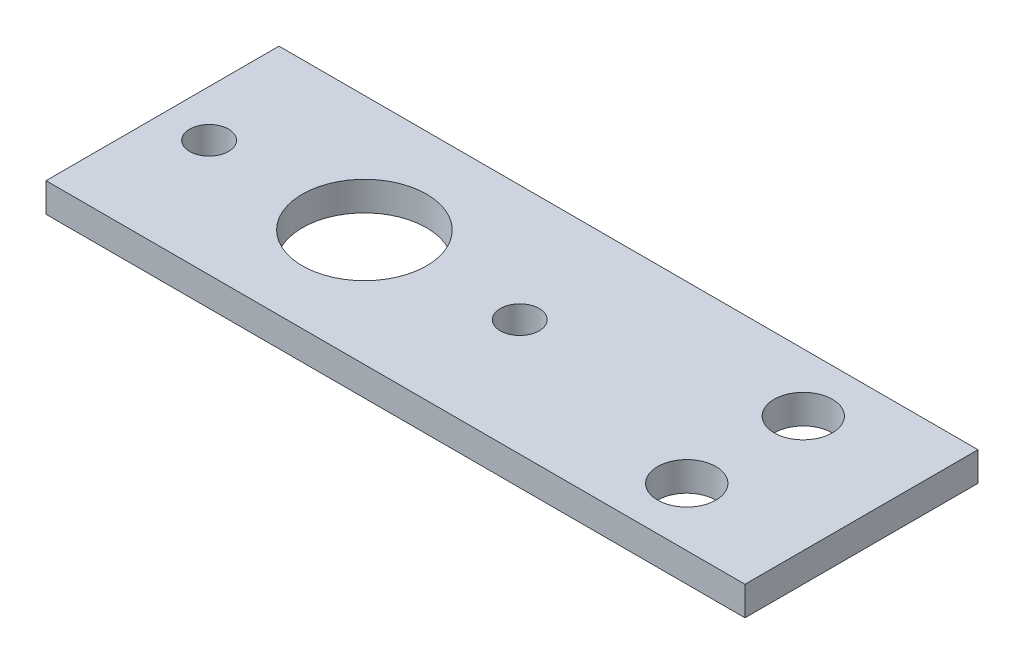
ISO-10303-21;
HEADER;
FILE_DESCRIPTION(('STEP AP214'),'2;1');
FILE_NAME('part.step','',(''),(''),'','','');
FILE_SCHEMA(('AUTOMOTIVE_DESIGN { 1 0 10303 214 1 1 1 1 }'));
ENDSEC;
DATA;
#1=APPLICATION_CONTEXT('core data for automotive mechanical design processes');
#2=APPLICATION_PROTOCOL_DEFINITION('international standard','automotive_design',2000,#1);
#3=PRODUCT_CONTEXT('',#1,'mechanical');
#4=PRODUCT('Part','Part','',(#3));
#5=PRODUCT_RELATED_PRODUCT_CATEGORY('part','',(#4));
#6=PRODUCT_DEFINITION_FORMATION('','',#4);
#7=PRODUCT_DEFINITION_CONTEXT('part definition',#1,'design');
#8=PRODUCT_DEFINITION('design','',#6,#7);
#9=PRODUCT_DEFINITION_SHAPE('','',#8);
#10=(LENGTH_UNIT() NAMED_UNIT(*) SI_UNIT(.MILLI.,.METRE.));
#11=(NAMED_UNIT(*) PLANE_ANGLE_UNIT() SI_UNIT($,.RADIAN.));
#12=(NAMED_UNIT(*) SI_UNIT($,.STERADIAN.) SOLID_ANGLE_UNIT());
#13=UNCERTAINTY_MEASURE_WITH_UNIT(LENGTH_MEASURE(1.E-05),#10,'distance_accuracy_value','');
#14=(GEOMETRIC_REPRESENTATION_CONTEXT(3) GLOBAL_UNCERTAINTY_ASSIGNED_CONTEXT((#13)) GLOBAL_UNIT_ASSIGNED_CONTEXT((#10,
#11,#12)) REPRESENTATION_CONTEXT('',''));
#15=CARTESIAN_POINT('',(0.,0.,0.));
#16=DIRECTION('',(0.,0.,1.));
#17=DIRECTION('',(1.,0.,0.));
#18=AXIS2_PLACEMENT_3D('',#15,#16,#17);
#19=CARTESIAN_POINT('',(0.,4.7625,0.));
#20=DIRECTION('',(0.,-1.,0.));
#21=DIRECTION('',(0.,0.,-1.));
#22=AXIS2_PLACEMENT_3D('',#19,#20,#21);
#23=PLANE('',#22);
#24=DIRECTION('',(0.,0.,1.));
#25=VECTOR('',#24,1.);
#26=CARTESIAN_POINT('',(-114.3,4.7625,19.05));
#27=LINE('',#26,#25);
#28=CARTESIAN_POINT('',(-114.3,4.7625,-19.05));
#29=VERTEX_POINT('',#28);
#30=CARTESIAN_POINT('',(-114.3,4.7625,19.05));
#31=VERTEX_POINT('',#30);
#32=EDGE_CURVE('E95',#29,#31,#27,.T.);
#33=ORIENTED_EDGE('',*,*,#32,.T.);
#34=DIRECTION('',(1.,0.,0.));
#35=VECTOR('',#34,1.);
#36=CARTESIAN_POINT('',(-114.3,4.7625,19.05));
#37=LINE('',#36,#35);
#38=CARTESIAN_POINT('',(0.,4.7625,19.05));
#39=VERTEX_POINT('',#38);
#40=EDGE_CURVE('E90',#31,#39,#37,.T.);
#41=ORIENTED_EDGE('',*,*,#40,.T.);
#42=DIRECTION('',(0.,0.,-1.));
#43=VECTOR('',#42,1.);
#44=CARTESIAN_POINT('',(0.,4.7625,-19.05));
#45=LINE('',#44,#43);
#46=CARTESIAN_POINT('',(0.,4.7625,-19.05));
#47=VERTEX_POINT('',#46);
#48=EDGE_CURVE('E93',#39,#47,#45,.T.);
#49=ORIENTED_EDGE('',*,*,#48,.T.);
#50=DIRECTION('',(-1.,0.,0.));
#51=VECTOR('',#50,1.);
#52=CARTESIAN_POINT('',(-114.3,4.7625,-19.05));
#53=LINE('',#52,#51);
#54=EDGE_CURVE('E60',#47,#29,#53,.T.);
#55=ORIENTED_EDGE('',*,*,#54,.T.);
#56=EDGE_LOOP('',(#33,#41,#49,#55));
#57=FACE_BOUND('',#56,.T.);
#58=CARTESIAN_POINT('',(-106.68,4.7625,0.));
#59=DIRECTION('',(0.,1.,0.));
#60=DIRECTION('',(0.,0.,1.));
#61=AXIS2_PLACEMENT_3D('',#58,#59,#60);
#62=CIRCLE('',#61,3.175);
#63=CARTESIAN_POINT('',(-106.68,4.7625,-3.175));
#64=VERTEX_POINT('',#63);
#65=EDGE_CURVE('E116',#64,#64,#62,.T.);
#66=ORIENTED_EDGE('',*,*,#65,.F.);
#67=EDGE_LOOP('',(#66));
#68=FACE_BOUND('',#67,.T.);
#69=CARTESIAN_POINT('',(-81.28,4.7625,0.));
#70=DIRECTION('',(0.,1.,0.));
#71=DIRECTION('',(0.,0.,1.));
#72=AXIS2_PLACEMENT_3D('',#69,#70,#71);
#73=CIRCLE('',#72,10.16);
#74=CARTESIAN_POINT('',(-81.28,4.7625,-10.16));
#75=VERTEX_POINT('',#74);
#76=EDGE_CURVE('E140',#75,#75,#73,.T.);
#77=ORIENTED_EDGE('',*,*,#76,.F.);
#78=EDGE_LOOP('',(#77));
#79=FACE_BOUND('',#78,.T.);
#80=CARTESIAN_POINT('',(-55.88,4.7625,0.));
#81=DIRECTION('',(0.,1.,0.));
#82=DIRECTION('',(0.,0.,1.));
#83=AXIS2_PLACEMENT_3D('',#80,#81,#82);
#84=CIRCLE('',#83,3.175);
#85=CARTESIAN_POINT('',(-55.88,4.7625,-3.175));
#86=VERTEX_POINT('',#85);
#87=EDGE_CURVE('E148',#86,#86,#84,.T.);
#88=ORIENTED_EDGE('',*,*,#87,.F.);
#89=EDGE_LOOP('',(#88));
#90=FACE_BOUND('',#89,.T.);
#91=CARTESIAN_POINT('',(-19.05,4.7625,-9.52499999999999));
#92=DIRECTION('',(0.,1.,0.));
#93=DIRECTION('',(0.,0.,1.));
#94=AXIS2_PLACEMENT_3D('',#91,#92,#93);
#95=CIRCLE('',#94,4.76250000000001);
#96=CARTESIAN_POINT('',(-19.05,4.7625,-14.2875));
#97=VERTEX_POINT('',#96);
#98=EDGE_CURVE('E156',#97,#97,#95,.T.);
#99=ORIENTED_EDGE('',*,*,#98,.F.);
#100=EDGE_LOOP('',(#99));
#101=FACE_BOUND('',#100,.T.);
#102=CARTESIAN_POINT('',(-19.05,4.7625,9.52500000000001));
#103=DIRECTION('',(0.,1.,0.));
#104=DIRECTION('',(0.,0.,-1.));
#105=AXIS2_PLACEMENT_3D('',#102,#103,#104);
#106=CIRCLE('',#105,4.76250000000001);
#107=CARTESIAN_POINT('',(-19.05,4.7625,4.7625));
#108=VERTEX_POINT('',#107);
#109=EDGE_CURVE('E164',#108,#108,#106,.T.);
#110=ORIENTED_EDGE('',*,*,#109,.F.);
#111=EDGE_LOOP('',(#110));
#112=FACE_BOUND('',#111,.T.);
#113=ADVANCED_FACE('F42',(#57,#68,#79,#90,#101,#112),#23,.F.);
#114=CARTESIAN_POINT('',(0.,0.,0.));
#115=DIRECTION('',(0.,-1.,0.));
#116=DIRECTION('',(0.,0.,-1.));
#117=AXIS2_PLACEMENT_3D('',#114,#115,#116);
#118=PLANE('',#117);
#119=CARTESIAN_POINT('',(-19.05,0.,-9.52499999999999));
#120=DIRECTION('',(0.,1.,0.));
#121=DIRECTION('',(0.,0.,1.));
#122=AXIS2_PLACEMENT_3D('',#119,#120,#121);
#123=CIRCLE('',#122,4.76250000000001);
#124=CARTESIAN_POINT('',(-19.05,0.,-14.2875));
#125=VERTEX_POINT('',#124);
#126=EDGE_CURVE('E160',#125,#125,#123,.T.);
#127=ORIENTED_EDGE('',*,*,#126,.T.);
#128=EDGE_LOOP('',(#127));
#129=FACE_BOUND('',#128,.T.);
#130=CARTESIAN_POINT('',(-81.28,0.,0.));
#131=DIRECTION('',(0.,1.,0.));
#132=DIRECTION('',(0.,0.,1.));
#133=AXIS2_PLACEMENT_3D('',#130,#131,#132);
#134=CIRCLE('',#133,10.16);
#135=CARTESIAN_POINT('',(-81.28,0.,-10.16));
#136=VERTEX_POINT('',#135);
#137=EDGE_CURVE('E144',#136,#136,#134,.T.);
#138=ORIENTED_EDGE('',*,*,#137,.T.);
#139=EDGE_LOOP('',(#138));
#140=FACE_BOUND('',#139,.T.);
#141=DIRECTION('',(0.,0.,1.));
#142=VECTOR('',#141,1.);
#143=CARTESIAN_POINT('',(-114.3,0.,19.05));
#144=LINE('',#143,#142);
#145=CARTESIAN_POINT('',(-114.3,0.,-19.05));
#146=VERTEX_POINT('',#145);
#147=CARTESIAN_POINT('',(-114.3,0.,19.05));
#148=VERTEX_POINT('',#147);
#149=EDGE_CURVE('E112',#146,#148,#144,.T.);
#150=ORIENTED_EDGE('',*,*,#149,.F.);
#151=DIRECTION('',(-1.,0.,0.));
#152=VECTOR('',#151,1.);
#153=CARTESIAN_POINT('',(-114.3,0.,-19.05));
#154=LINE('',#153,#152);
#155=CARTESIAN_POINT('',(0.,0.,-19.05));
#156=VERTEX_POINT('',#155);
#157=EDGE_CURVE('E83',#156,#146,#154,.T.);
#158=ORIENTED_EDGE('',*,*,#157,.F.);
#159=DIRECTION('',(0.,0.,-1.));
#160=VECTOR('',#159,1.);
#161=CARTESIAN_POINT('',(0.,0.,-19.05));
#162=LINE('',#161,#160);
#163=CARTESIAN_POINT('',(0.,0.,19.05));
#164=VERTEX_POINT('',#163);
#165=EDGE_CURVE('E77',#164,#156,#162,.T.);
#166=ORIENTED_EDGE('',*,*,#165,.F.);
#167=DIRECTION('',(1.,0.,0.));
#168=VECTOR('',#167,1.);
#169=CARTESIAN_POINT('',(-114.3,0.,19.05));
#170=LINE('',#169,#168);
#171=EDGE_CURVE('E100',#148,#164,#170,.T.);
#172=ORIENTED_EDGE('',*,*,#171,.F.);
#173=EDGE_LOOP('',(#150,#158,#166,#172));
#174=FACE_BOUND('',#173,.T.);
#175=CARTESIAN_POINT('',(-106.68,0.,0.));
#176=DIRECTION('',(0.,1.,0.));
#177=DIRECTION('',(0.,0.,1.));
#178=AXIS2_PLACEMENT_3D('',#175,#176,#177);
#179=CIRCLE('',#178,3.175);
#180=CARTESIAN_POINT('',(-106.68,0.,-3.175));
#181=VERTEX_POINT('',#180);
#182=EDGE_CURVE('E136',#181,#181,#179,.T.);
#183=ORIENTED_EDGE('',*,*,#182,.T.);
#184=EDGE_LOOP('',(#183));
#185=FACE_BOUND('',#184,.T.);
#186=CARTESIAN_POINT('',(-55.88,0.,0.));
#187=DIRECTION('',(0.,1.,0.));
#188=DIRECTION('',(0.,0.,1.));
#189=AXIS2_PLACEMENT_3D('',#186,#187,#188);
#190=CIRCLE('',#189,3.175);
#191=CARTESIAN_POINT('',(-55.88,0.,-3.175));
#192=VERTEX_POINT('',#191);
#193=EDGE_CURVE('E152',#192,#192,#190,.T.);
#194=ORIENTED_EDGE('',*,*,#193,.T.);
#195=EDGE_LOOP('',(#194));
#196=FACE_BOUND('',#195,.T.);
#197=CARTESIAN_POINT('',(-19.05,0.,9.52500000000001));
#198=DIRECTION('',(0.,1.,0.));
#199=DIRECTION('',(0.,0.,-1.));
#200=AXIS2_PLACEMENT_3D('',#197,#198,#199);
#201=CIRCLE('',#200,4.76250000000001);
#202=CARTESIAN_POINT('',(-19.05,0.,4.7625));
#203=VERTEX_POINT('',#202);
#204=EDGE_CURVE('E168',#203,#203,#201,.T.);
#205=ORIENTED_EDGE('',*,*,#204,.T.);
#206=EDGE_LOOP('',(#205));
#207=FACE_BOUND('',#206,.T.);
#208=ADVANCED_FACE('F130',(#129,#140,#174,#185,#196,#207),#118,.T.);
#209=CARTESIAN_POINT('',(-114.3,4.7625,19.05));
#210=DIRECTION('',(1.,0.,0.));
#211=DIRECTION('',(0.,0.,-1.));
#212=AXIS2_PLACEMENT_3D('',#209,#210,#211);
#213=PLANE('',#212);
#214=ORIENTED_EDGE('',*,*,#149,.T.);
#215=DIRECTION('',(0.,-1.,0.));
#216=VECTOR('',#215,1.);
#217=CARTESIAN_POINT('',(-114.3,4.7625,19.05));
#218=LINE('',#217,#216);
#219=EDGE_CURVE('E11',#31,#148,#218,.T.);
#220=ORIENTED_EDGE('',*,*,#219,.F.);
#221=ORIENTED_EDGE('',*,*,#32,.F.);
#222=DIRECTION('',(0.,-1.,0.));
#223=VECTOR('',#222,1.);
#224=CARTESIAN_POINT('',(-114.3,4.7625,-19.05));
#225=LINE('',#224,#223);
#226=EDGE_CURVE('E108',#29,#146,#225,.T.);
#227=ORIENTED_EDGE('',*,*,#226,.T.);
#228=EDGE_LOOP('',(#214,#220,#221,#227));
#229=FACE_BOUND('',#228,.T.);
#230=ADVANCED_FACE('F44',(#229),#213,.F.);
#231=CARTESIAN_POINT('',(-114.3,4.7625,19.05));
#232=DIRECTION('',(0.,0.,-1.));
#233=DIRECTION('',(-1.,0.,0.));
#234=AXIS2_PLACEMENT_3D('',#231,#232,#233);
#235=PLANE('',#234);
#236=ORIENTED_EDGE('',*,*,#171,.T.);
#237=DIRECTION('',(0.,-1.,0.));
#238=VECTOR('',#237,1.);
#239=CARTESIAN_POINT('',(0.,4.7625,19.05));
#240=LINE('',#239,#238);
#241=EDGE_CURVE('E52',#39,#164,#240,.T.);
#242=ORIENTED_EDGE('',*,*,#241,.F.);
#243=ORIENTED_EDGE('',*,*,#40,.F.);
#244=ORIENTED_EDGE('',*,*,#219,.T.);
#245=EDGE_LOOP('',(#236,#242,#243,#244));
#246=FACE_BOUND('',#245,.T.);
#247=ADVANCED_FACE('F99',(#246),#235,.F.);
#248=CARTESIAN_POINT('',(0.,4.7625,-19.05));
#249=DIRECTION('',(-1.,0.,0.));
#250=DIRECTION('',(0.,0.,1.));
#251=AXIS2_PLACEMENT_3D('',#248,#249,#250);
#252=PLANE('',#251);
#253=ORIENTED_EDGE('',*,*,#165,.T.);
#254=DIRECTION('',(0.,-1.,0.));
#255=VECTOR('',#254,1.);
#256=CARTESIAN_POINT('',(0.,4.7625,-19.05));
#257=LINE('',#256,#255);
#258=EDGE_CURVE('E102',#47,#156,#257,.T.);
#259=ORIENTED_EDGE('',*,*,#258,.F.);
#260=ORIENTED_EDGE('',*,*,#48,.F.);
#261=ORIENTED_EDGE('',*,*,#241,.T.);
#262=EDGE_LOOP('',(#253,#259,#260,#261));
#263=FACE_BOUND('',#262,.T.);
#264=ADVANCED_FACE('F103',(#263),#252,.F.);
#265=CARTESIAN_POINT('',(-114.3,4.7625,-19.05));
#266=DIRECTION('',(0.,0.,1.));
#267=DIRECTION('',(1.,0.,0.));
#268=AXIS2_PLACEMENT_3D('',#265,#266,#267);
#269=PLANE('',#268);
#270=ORIENTED_EDGE('',*,*,#157,.T.);
#271=ORIENTED_EDGE('',*,*,#226,.F.);
#272=ORIENTED_EDGE('',*,*,#54,.F.);
#273=ORIENTED_EDGE('',*,*,#258,.T.);
#274=EDGE_LOOP('',(#270,#271,#272,#273));
#275=FACE_BOUND('',#274,.T.);
#276=ADVANCED_FACE('F127',(#275),#269,.F.);
#277=CARTESIAN_POINT('',(-106.68,4.7625,0.));
#278=DIRECTION('',(0.,-1.,0.));
#279=DIRECTION('',(0.,0.,-1.));
#280=AXIS2_PLACEMENT_3D('',#277,#278,#279);
#281=CYLINDRICAL_SURFACE('',#280,3.175);
#282=CARTESIAN_POINT('',(-106.68,4.7625,-3.175));
#283=CARTESIAN_POINT('',(-106.68,4.712890625,-3.175));
#284=CARTESIAN_POINT('',(-106.68,4.66328125,-3.175));
#285=CARTESIAN_POINT('',(-106.68,4.5640625,-3.175));
#286=CARTESIAN_POINT('',(-106.68,4.514453125,-3.175));
#287=CARTESIAN_POINT('',(-106.68,4.415234375,-3.175));
#288=CARTESIAN_POINT('',(-106.68,4.365625,-3.175));
#289=CARTESIAN_POINT('',(-106.68,4.26640625,-3.175));
#290=CARTESIAN_POINT('',(-106.68,4.216796875,-3.175));
#291=CARTESIAN_POINT('',(-106.68,4.117578125,-3.175));
#292=CARTESIAN_POINT('',(-106.68,4.06796875,-3.175));
#293=CARTESIAN_POINT('',(-106.68,3.96875,-3.175));
#294=CARTESIAN_POINT('',(-106.68,3.919140625,-3.175));
#295=CARTESIAN_POINT('',(-106.68,3.819921875,-3.175));
#296=CARTESIAN_POINT('',(-106.68,3.7703125,-3.175));
#297=CARTESIAN_POINT('',(-106.68,3.67109375,-3.175));
#298=CARTESIAN_POINT('',(-106.68,3.621484375,-3.175));
#299=CARTESIAN_POINT('',(-106.68,3.522265625,-3.175));
#300=CARTESIAN_POINT('',(-106.68,3.47265625,-3.175));
#301=CARTESIAN_POINT('',(-106.68,3.3734375,-3.175));
#302=CARTESIAN_POINT('',(-106.68,3.323828125,-3.175));
#303=CARTESIAN_POINT('',(-106.68,3.224609375,-3.175));
#304=CARTESIAN_POINT('',(-106.68,3.175,-3.175));
#305=CARTESIAN_POINT('',(-106.68,3.07578125,-3.175));
#306=CARTESIAN_POINT('',(-106.68,3.026171875,-3.175));
#307=CARTESIAN_POINT('',(-106.68,2.926953125,-3.175));
#308=CARTESIAN_POINT('',(-106.68,2.87734375,-3.175));
#309=CARTESIAN_POINT('',(-106.68,2.778125,-3.175));
#310=CARTESIAN_POINT('',(-106.68,2.728515625,-3.175));
#311=CARTESIAN_POINT('',(-106.68,2.629296875,-3.175));
#312=CARTESIAN_POINT('',(-106.68,2.5796875,-3.175));
#313=CARTESIAN_POINT('',(-106.68,2.48046875,-3.175));
#314=CARTESIAN_POINT('',(-106.68,2.430859375,-3.175));
#315=CARTESIAN_POINT('',(-106.68,2.331640625,-3.175));
#316=CARTESIAN_POINT('',(-106.68,2.28203125,-3.175));
#317=CARTESIAN_POINT('',(-106.68,2.1828125,-3.175));
#318=CARTESIAN_POINT('',(-106.68,2.133203125,-3.175));
#319=CARTESIAN_POINT('',(-106.68,2.033984375,-3.175));
#320=CARTESIAN_POINT('',(-106.68,1.984375,-3.175));
#321=CARTESIAN_POINT('',(-106.68,1.88515625,-3.175));
#322=CARTESIAN_POINT('',(-106.68,1.835546875,-3.175));
#323=CARTESIAN_POINT('',(-106.68,1.736328125,-3.175));
#324=CARTESIAN_POINT('',(-106.68,1.68671875,-3.175));
#325=CARTESIAN_POINT('',(-106.68,1.5875,-3.175));
#326=CARTESIAN_POINT('',(-106.68,1.537890625,-3.175));
#327=CARTESIAN_POINT('',(-106.68,1.438671875,-3.175));
#328=CARTESIAN_POINT('',(-106.68,1.3890625,-3.175));
#329=CARTESIAN_POINT('',(-106.68,1.28984375,-3.175));
#330=CARTESIAN_POINT('',(-106.68,1.240234375,-3.175));
#331=CARTESIAN_POINT('',(-106.68,1.141015625,-3.175));
#332=CARTESIAN_POINT('',(-106.68,1.09140625,-3.175));
#333=CARTESIAN_POINT('',(-106.68,0.9921875,-3.175));
#334=CARTESIAN_POINT('',(-106.68,0.942578125,-3.175));
#335=CARTESIAN_POINT('',(-106.68,0.843359375,-3.175));
#336=CARTESIAN_POINT('',(-106.68,0.79375,-3.175));
#337=CARTESIAN_POINT('',(-106.68,0.69453125,-3.175));
#338=CARTESIAN_POINT('',(-106.68,0.644921875,-3.175));
#339=CARTESIAN_POINT('',(-106.68,0.545703125,-3.175));
#340=CARTESIAN_POINT('',(-106.68,0.49609375,-3.175));
#341=CARTESIAN_POINT('',(-106.68,0.396875,-3.175));
#342=CARTESIAN_POINT('',(-106.68,0.347265625,-3.175));
#343=CARTESIAN_POINT('',(-106.68,0.248046875,-3.175));
#344=CARTESIAN_POINT('',(-106.68,0.1984375,-3.175));
#345=CARTESIAN_POINT('',(-106.68,0.09921875,-3.175));
#346=CARTESIAN_POINT('',(-106.68,0.049609375,-3.175));
#347=CARTESIAN_POINT('',(-106.68,0.,-3.175));
#348=B_SPLINE_CURVE_WITH_KNOTS('',3,(#282,#283,#284,#285,#286,#287,#288,#289,#290,#291,#292,
#293,#294,#295,#296,#297,#298,#299,#300,#301,#302,#303,#304,#305,#306,#307,#308,#309,#310,#311,
#312,#313,#314,#315,#316,#317,#318,#319,#320,#321,#322,#323,#324,#325,#326,#327,#328,#329,#330,
#331,#332,#333,#334,#335,#336,#337,#338,#339,#340,#341,#342,#343,#344,#345,#346,#347),
.UNSPECIFIED.,.F.,.F.,(4,2,2,2,2,2,2,2,2,2,2,2,2,2,2,2,2,2,2,2,2,2,2,2,2,2,2,2,2,2,2,2,4),(0.,
0.148828124999999,0.297656249999999,0.446484374999999,0.595312499999999,0.744140625,0.89296875,
1.041796875,1.190625,1.339453125,1.48828125,1.637109375,1.7859375,1.934765625,2.08359375,
2.232421875,2.38125,2.530078125,2.67890625,2.827734375,2.9765625,3.125390625,3.27421875,
3.423046875,3.571875,3.720703125,3.86953125,4.018359375,4.1671875,4.316015625,4.46484375,
4.613671875,4.7625),.UNSPECIFIED.);
#349=EDGE_CURVE('BSEAM188',#64,#181,#348,.T.);
#350=ORIENTED_EDGE('',*,*,#65,.T.);
#351=ORIENTED_EDGE('',*,*,#182,.F.);
#352=ORIENTED_EDGE('',*,*,#349,.T.);
#353=ORIENTED_EDGE('',*,*,#349,.F.);
#354=EDGE_LOOP('',(#350,#352,#351,#353));
#355=FACE_BOUND('',#354,.T.);
#356=ADVANCED_FACE('F188',(#355),#281,.F.);
#357=CARTESIAN_POINT('',(-81.28,4.7625,0.));
#358=DIRECTION('',(0.,-1.,0.));
#359=DIRECTION('',(0.,0.,-1.));
#360=AXIS2_PLACEMENT_3D('',#357,#358,#359);
#361=CYLINDRICAL_SURFACE('',#360,10.16);
#362=CARTESIAN_POINT('',(-81.28,4.7625,-10.16));
#363=CARTESIAN_POINT('',(-81.28,4.712890625,-10.16));
#364=CARTESIAN_POINT('',(-81.28,4.66328125,-10.16));
#365=CARTESIAN_POINT('',(-81.28,4.5640625,-10.16));
#366=CARTESIAN_POINT('',(-81.28,4.514453125,-10.16));
#367=CARTESIAN_POINT('',(-81.28,4.415234375,-10.16));
#368=CARTESIAN_POINT('',(-81.28,4.365625,-10.16));
#369=CARTESIAN_POINT('',(-81.28,4.26640625,-10.16));
#370=CARTESIAN_POINT('',(-81.28,4.216796875,-10.16));
#371=CARTESIAN_POINT('',(-81.28,4.117578125,-10.16));
#372=CARTESIAN_POINT('',(-81.28,4.06796875,-10.16));
#373=CARTESIAN_POINT('',(-81.28,3.96875,-10.16));
#374=CARTESIAN_POINT('',(-81.28,3.919140625,-10.16));
#375=CARTESIAN_POINT('',(-81.28,3.819921875,-10.16));
#376=CARTESIAN_POINT('',(-81.28,3.7703125,-10.16));
#377=CARTESIAN_POINT('',(-81.28,3.67109375,-10.16));
#378=CARTESIAN_POINT('',(-81.28,3.621484375,-10.16));
#379=CARTESIAN_POINT('',(-81.28,3.522265625,-10.16));
#380=CARTESIAN_POINT('',(-81.28,3.47265625,-10.16));
#381=CARTESIAN_POINT('',(-81.28,3.3734375,-10.16));
#382=CARTESIAN_POINT('',(-81.28,3.323828125,-10.16));
#383=CARTESIAN_POINT('',(-81.28,3.224609375,-10.16));
#384=CARTESIAN_POINT('',(-81.28,3.175,-10.16));
#385=CARTESIAN_POINT('',(-81.28,3.07578125,-10.16));
#386=CARTESIAN_POINT('',(-81.28,3.026171875,-10.16));
#387=CARTESIAN_POINT('',(-81.28,2.926953125,-10.16));
#388=CARTESIAN_POINT('',(-81.28,2.87734375,-10.16));
#389=CARTESIAN_POINT('',(-81.28,2.778125,-10.16));
#390=CARTESIAN_POINT('',(-81.28,2.728515625,-10.16));
#391=CARTESIAN_POINT('',(-81.28,2.629296875,-10.16));
#392=CARTESIAN_POINT('',(-81.28,2.5796875,-10.16));
#393=CARTESIAN_POINT('',(-81.28,2.48046875,-10.16));
#394=CARTESIAN_POINT('',(-81.28,2.430859375,-10.16));
#395=CARTESIAN_POINT('',(-81.28,2.331640625,-10.16));
#396=CARTESIAN_POINT('',(-81.28,2.28203125,-10.16));
#397=CARTESIAN_POINT('',(-81.28,2.1828125,-10.16));
#398=CARTESIAN_POINT('',(-81.28,2.133203125,-10.16));
#399=CARTESIAN_POINT('',(-81.28,2.033984375,-10.16));
#400=CARTESIAN_POINT('',(-81.28,1.984375,-10.16));
#401=CARTESIAN_POINT('',(-81.28,1.88515625,-10.16));
#402=CARTESIAN_POINT('',(-81.28,1.835546875,-10.16));
#403=CARTESIAN_POINT('',(-81.28,1.736328125,-10.16));
#404=CARTESIAN_POINT('',(-81.28,1.68671875,-10.16));
#405=CARTESIAN_POINT('',(-81.28,1.5875,-10.16));
#406=CARTESIAN_POINT('',(-81.28,1.537890625,-10.16));
#407=CARTESIAN_POINT('',(-81.28,1.438671875,-10.16));
#408=CARTESIAN_POINT('',(-81.28,1.3890625,-10.16));
#409=CARTESIAN_POINT('',(-81.28,1.28984375,-10.16));
#410=CARTESIAN_POINT('',(-81.28,1.240234375,-10.16));
#411=CARTESIAN_POINT('',(-81.28,1.141015625,-10.16));
#412=CARTESIAN_POINT('',(-81.28,1.09140625,-10.16));
#413=CARTESIAN_POINT('',(-81.28,0.9921875,-10.16));
#414=CARTESIAN_POINT('',(-81.28,0.942578125,-10.16));
#415=CARTESIAN_POINT('',(-81.28,0.843359375,-10.16));
#416=CARTESIAN_POINT('',(-81.28,0.79375,-10.16));
#417=CARTESIAN_POINT('',(-81.28,0.69453125,-10.16));
#418=CARTESIAN_POINT('',(-81.28,0.644921875,-10.16));
#419=CARTESIAN_POINT('',(-81.28,0.545703125,-10.16));
#420=CARTESIAN_POINT('',(-81.28,0.49609375,-10.16));
#421=CARTESIAN_POINT('',(-81.28,0.396875,-10.16));
#422=CARTESIAN_POINT('',(-81.28,0.347265625,-10.16));
#423=CARTESIAN_POINT('',(-81.28,0.248046875,-10.16));
#424=CARTESIAN_POINT('',(-81.28,0.1984375,-10.16));
#425=CARTESIAN_POINT('',(-81.28,0.09921875,-10.16));
#426=CARTESIAN_POINT('',(-81.28,0.049609375,-10.16));
#427=CARTESIAN_POINT('',(-81.28,0.,-10.16));
#428=B_SPLINE_CURVE_WITH_KNOTS('',3,(#362,#363,#364,#365,#366,#367,#368,#369,#370,#371,#372,
#373,#374,#375,#376,#377,#378,#379,#380,#381,#382,#383,#384,#385,#386,#387,#388,#389,#390,#391,
#392,#393,#394,#395,#396,#397,#398,#399,#400,#401,#402,#403,#404,#405,#406,#407,#408,#409,#410,
#411,#412,#413,#414,#415,#416,#417,#418,#419,#420,#421,#422,#423,#424,#425,#426,#427),
.UNSPECIFIED.,.F.,.F.,(4,2,2,2,2,2,2,2,2,2,2,2,2,2,2,2,2,2,2,2,2,2,2,2,2,2,2,2,2,2,2,2,4),(0.,
0.148828124999999,0.297656249999999,0.446484374999999,0.595312499999999,0.744140625,0.89296875,
1.041796875,1.190625,1.339453125,1.48828125,1.637109375,1.7859375,1.934765625,2.08359375,
2.232421875,2.38125,2.530078125,2.67890625,2.827734375,2.9765625,3.125390625,3.27421875,
3.423046875,3.571875,3.720703125,3.86953125,4.018359375,4.1671875,4.316015625,4.46484375,
4.613671875,4.7625),.UNSPECIFIED.);
#429=EDGE_CURVE('BSEAM242',#75,#136,#428,.T.);
#430=ORIENTED_EDGE('',*,*,#76,.T.);
#431=ORIENTED_EDGE('',*,*,#137,.F.);
#432=ORIENTED_EDGE('',*,*,#429,.T.);
#433=ORIENTED_EDGE('',*,*,#429,.F.);
#434=EDGE_LOOP('',(#430,#432,#431,#433));
#435=FACE_BOUND('',#434,.T.);
#436=ADVANCED_FACE('F242',(#435),#361,.F.);
#437=CARTESIAN_POINT('',(-55.88,4.7625,0.));
#438=DIRECTION('',(0.,-1.,0.));
#439=DIRECTION('',(0.,0.,-1.));
#440=AXIS2_PLACEMENT_3D('',#437,#438,#439);
#441=CYLINDRICAL_SURFACE('',#440,3.175);
#442=CARTESIAN_POINT('',(-55.88,4.7625,-3.175));
#443=CARTESIAN_POINT('',(-55.88,4.712890625,-3.175));
#444=CARTESIAN_POINT('',(-55.88,4.66328125,-3.175));
#445=CARTESIAN_POINT('',(-55.88,4.5640625,-3.175));
#446=CARTESIAN_POINT('',(-55.88,4.514453125,-3.175));
#447=CARTESIAN_POINT('',(-55.88,4.415234375,-3.175));
#448=CARTESIAN_POINT('',(-55.88,4.365625,-3.175));
#449=CARTESIAN_POINT('',(-55.88,4.26640625,-3.175));
#450=CARTESIAN_POINT('',(-55.88,4.216796875,-3.175));
#451=CARTESIAN_POINT('',(-55.88,4.117578125,-3.175));
#452=CARTESIAN_POINT('',(-55.88,4.06796875,-3.175));
#453=CARTESIAN_POINT('',(-55.88,3.96875,-3.175));
#454=CARTESIAN_POINT('',(-55.88,3.919140625,-3.175));
#455=CARTESIAN_POINT('',(-55.88,3.819921875,-3.175));
#456=CARTESIAN_POINT('',(-55.88,3.7703125,-3.175));
#457=CARTESIAN_POINT('',(-55.88,3.67109375,-3.175));
#458=CARTESIAN_POINT('',(-55.88,3.621484375,-3.175));
#459=CARTESIAN_POINT('',(-55.88,3.522265625,-3.175));
#460=CARTESIAN_POINT('',(-55.88,3.47265625,-3.175));
#461=CARTESIAN_POINT('',(-55.88,3.3734375,-3.175));
#462=CARTESIAN_POINT('',(-55.88,3.323828125,-3.175));
#463=CARTESIAN_POINT('',(-55.88,3.224609375,-3.175));
#464=CARTESIAN_POINT('',(-55.88,3.175,-3.175));
#465=CARTESIAN_POINT('',(-55.88,3.07578125,-3.175));
#466=CARTESIAN_POINT('',(-55.88,3.026171875,-3.175));
#467=CARTESIAN_POINT('',(-55.88,2.926953125,-3.175));
#468=CARTESIAN_POINT('',(-55.88,2.87734375,-3.175));
#469=CARTESIAN_POINT('',(-55.88,2.778125,-3.175));
#470=CARTESIAN_POINT('',(-55.88,2.728515625,-3.175));
#471=CARTESIAN_POINT('',(-55.88,2.629296875,-3.175));
#472=CARTESIAN_POINT('',(-55.88,2.5796875,-3.175));
#473=CARTESIAN_POINT('',(-55.88,2.48046875,-3.175));
#474=CARTESIAN_POINT('',(-55.88,2.430859375,-3.175));
#475=CARTESIAN_POINT('',(-55.88,2.331640625,-3.175));
#476=CARTESIAN_POINT('',(-55.88,2.28203125,-3.175));
#477=CARTESIAN_POINT('',(-55.88,2.1828125,-3.175));
#478=CARTESIAN_POINT('',(-55.88,2.133203125,-3.175));
#479=CARTESIAN_POINT('',(-55.88,2.033984375,-3.175));
#480=CARTESIAN_POINT('',(-55.88,1.984375,-3.175));
#481=CARTESIAN_POINT('',(-55.88,1.88515625,-3.175));
#482=CARTESIAN_POINT('',(-55.88,1.835546875,-3.175));
#483=CARTESIAN_POINT('',(-55.88,1.736328125,-3.175));
#484=CARTESIAN_POINT('',(-55.88,1.68671875,-3.175));
#485=CARTESIAN_POINT('',(-55.88,1.5875,-3.175));
#486=CARTESIAN_POINT('',(-55.88,1.537890625,-3.175));
#487=CARTESIAN_POINT('',(-55.88,1.438671875,-3.175));
#488=CARTESIAN_POINT('',(-55.88,1.3890625,-3.175));
#489=CARTESIAN_POINT('',(-55.88,1.28984375,-3.175));
#490=CARTESIAN_POINT('',(-55.88,1.240234375,-3.175));
#491=CARTESIAN_POINT('',(-55.88,1.141015625,-3.175));
#492=CARTESIAN_POINT('',(-55.88,1.09140625,-3.175));
#493=CARTESIAN_POINT('',(-55.88,0.9921875,-3.175));
#494=CARTESIAN_POINT('',(-55.88,0.942578125,-3.175));
#495=CARTESIAN_POINT('',(-55.88,0.843359375,-3.175));
#496=CARTESIAN_POINT('',(-55.88,0.79375,-3.175));
#497=CARTESIAN_POINT('',(-55.88,0.69453125,-3.175));
#498=CARTESIAN_POINT('',(-55.88,0.644921875,-3.175));
#499=CARTESIAN_POINT('',(-55.88,0.545703125,-3.175));
#500=CARTESIAN_POINT('',(-55.88,0.49609375,-3.175));
#501=CARTESIAN_POINT('',(-55.88,0.396875,-3.175));
#502=CARTESIAN_POINT('',(-55.88,0.347265625,-3.175));
#503=CARTESIAN_POINT('',(-55.88,0.248046875,-3.175));
#504=CARTESIAN_POINT('',(-55.88,0.1984375,-3.175));
#505=CARTESIAN_POINT('',(-55.88,0.09921875,-3.175));
#506=CARTESIAN_POINT('',(-55.88,0.049609375,-3.175));
#507=CARTESIAN_POINT('',(-55.88,0.,-3.175));
#508=B_SPLINE_CURVE_WITH_KNOTS('',3,(#442,#443,#444,#445,#446,#447,#448,#449,#450,#451,#452,
#453,#454,#455,#456,#457,#458,#459,#460,#461,#462,#463,#464,#465,#466,#467,#468,#469,#470,#471,
#472,#473,#474,#475,#476,#477,#478,#479,#480,#481,#482,#483,#484,#485,#486,#487,#488,#489,#490,
#491,#492,#493,#494,#495,#496,#497,#498,#499,#500,#501,#502,#503,#504,#505,#506,#507),
.UNSPECIFIED.,.F.,.F.,(4,2,2,2,2,2,2,2,2,2,2,2,2,2,2,2,2,2,2,2,2,2,2,2,2,2,2,2,2,2,2,2,4),(0.,
0.148828124999999,0.297656249999999,0.446484374999999,0.595312499999999,0.744140625,0.89296875,
1.041796875,1.190625,1.339453125,1.48828125,1.637109375,1.7859375,1.934765625,2.08359375,
2.232421875,2.38125,2.530078125,2.67890625,2.827734375,2.9765625,3.125390625,3.27421875,
3.423046875,3.571875,3.720703125,3.86953125,4.018359375,4.1671875,4.316015625,4.46484375,
4.613671875,4.7625),.UNSPECIFIED.);
#509=EDGE_CURVE('BSEAM251',#86,#192,#508,.T.);
#510=ORIENTED_EDGE('',*,*,#87,.T.);
#511=ORIENTED_EDGE('',*,*,#193,.F.);
#512=ORIENTED_EDGE('',*,*,#509,.T.);
#513=ORIENTED_EDGE('',*,*,#509,.F.);
#514=EDGE_LOOP('',(#510,#512,#511,#513));
#515=FACE_BOUND('',#514,.T.);
#516=ADVANCED_FACE('F251',(#515),#441,.F.);
#517=CARTESIAN_POINT('',(-19.05,4.7625,-9.52499999999999));
#518=DIRECTION('',(0.,-1.,0.));
#519=DIRECTION('',(0.,0.,-1.));
#520=AXIS2_PLACEMENT_3D('',#517,#518,#519);
#521=CYLINDRICAL_SURFACE('',#520,4.76250000000001);
#522=CARTESIAN_POINT('',(-19.05,4.7625,-14.2875));
#523=CARTESIAN_POINT('',(-19.05,4.712890625,-14.2875));
#524=CARTESIAN_POINT('',(-19.05,4.66328125,-14.2875));
#525=CARTESIAN_POINT('',(-19.05,4.5640625,-14.2875));
#526=CARTESIAN_POINT('',(-19.05,4.514453125,-14.2875));
#527=CARTESIAN_POINT('',(-19.05,4.415234375,-14.2875));
#528=CARTESIAN_POINT('',(-19.05,4.365625,-14.2875));
#529=CARTESIAN_POINT('',(-19.05,4.26640625,-14.2875));
#530=CARTESIAN_POINT('',(-19.05,4.216796875,-14.2875));
#531=CARTESIAN_POINT('',(-19.05,4.117578125,-14.2875));
#532=CARTESIAN_POINT('',(-19.05,4.06796875,-14.2875));
#533=CARTESIAN_POINT('',(-19.05,3.96875,-14.2875));
#534=CARTESIAN_POINT('',(-19.05,3.919140625,-14.2875));
#535=CARTESIAN_POINT('',(-19.05,3.819921875,-14.2875));
#536=CARTESIAN_POINT('',(-19.05,3.7703125,-14.2875));
#537=CARTESIAN_POINT('',(-19.05,3.67109375,-14.2875));
#538=CARTESIAN_POINT('',(-19.05,3.621484375,-14.2875));
#539=CARTESIAN_POINT('',(-19.05,3.522265625,-14.2875));
#540=CARTESIAN_POINT('',(-19.05,3.47265625,-14.2875));
#541=CARTESIAN_POINT('',(-19.05,3.3734375,-14.2875));
#542=CARTESIAN_POINT('',(-19.05,3.323828125,-14.2875));
#543=CARTESIAN_POINT('',(-19.05,3.224609375,-14.2875));
#544=CARTESIAN_POINT('',(-19.05,3.175,-14.2875));
#545=CARTESIAN_POINT('',(-19.05,3.07578125,-14.2875));
#546=CARTESIAN_POINT('',(-19.05,3.026171875,-14.2875));
#547=CARTESIAN_POINT('',(-19.05,2.926953125,-14.2875));
#548=CARTESIAN_POINT('',(-19.05,2.87734375,-14.2875));
#549=CARTESIAN_POINT('',(-19.05,2.778125,-14.2875));
#550=CARTESIAN_POINT('',(-19.05,2.728515625,-14.2875));
#551=CARTESIAN_POINT('',(-19.05,2.629296875,-14.2875));
#552=CARTESIAN_POINT('',(-19.05,2.5796875,-14.2875));
#553=CARTESIAN_POINT('',(-19.05,2.48046875,-14.2875));
#554=CARTESIAN_POINT('',(-19.05,2.430859375,-14.2875));
#555=CARTESIAN_POINT('',(-19.05,2.331640625,-14.2875));
#556=CARTESIAN_POINT('',(-19.05,2.28203125,-14.2875));
#557=CARTESIAN_POINT('',(-19.05,2.1828125,-14.2875));
#558=CARTESIAN_POINT('',(-19.05,2.133203125,-14.2875));
#559=CARTESIAN_POINT('',(-19.05,2.033984375,-14.2875));
#560=CARTESIAN_POINT('',(-19.05,1.984375,-14.2875));
#561=CARTESIAN_POINT('',(-19.05,1.88515625,-14.2875));
#562=CARTESIAN_POINT('',(-19.05,1.835546875,-14.2875));
#563=CARTESIAN_POINT('',(-19.05,1.736328125,-14.2875));
#564=CARTESIAN_POINT('',(-19.05,1.68671875,-14.2875));
#565=CARTESIAN_POINT('',(-19.05,1.5875,-14.2875));
#566=CARTESIAN_POINT('',(-19.05,1.537890625,-14.2875));
#567=CARTESIAN_POINT('',(-19.05,1.438671875,-14.2875));
#568=CARTESIAN_POINT('',(-19.05,1.3890625,-14.2875));
#569=CARTESIAN_POINT('',(-19.05,1.28984375,-14.2875));
#570=CARTESIAN_POINT('',(-19.05,1.240234375,-14.2875));
#571=CARTESIAN_POINT('',(-19.05,1.141015625,-14.2875));
#572=CARTESIAN_POINT('',(-19.05,1.09140625,-14.2875));
#573=CARTESIAN_POINT('',(-19.05,0.992187499999999,-14.2875));
#574=CARTESIAN_POINT('',(-19.05,0.942578124999999,-14.2875));
#575=CARTESIAN_POINT('',(-19.05,0.843359375,-14.2875));
#576=CARTESIAN_POINT('',(-19.05,0.79375,-14.2875));
#577=CARTESIAN_POINT('',(-19.05,0.69453125,-14.2875));
#578=CARTESIAN_POINT('',(-19.05,0.644921875,-14.2875));
#579=CARTESIAN_POINT('',(-19.05,0.545703125,-14.2875));
#580=CARTESIAN_POINT('',(-19.05,0.49609375,-14.2875));
#581=CARTESIAN_POINT('',(-19.05,0.396875,-14.2875));
#582=CARTESIAN_POINT('',(-19.05,0.347265625,-14.2875));
#583=CARTESIAN_POINT('',(-19.05,0.248046875,-14.2875));
#584=CARTESIAN_POINT('',(-19.05,0.1984375,-14.2875));
#585=CARTESIAN_POINT('',(-19.05,0.09921875,-14.2875));
#586=CARTESIAN_POINT('',(-19.05,0.049609375,-14.2875));
#587=CARTESIAN_POINT('',(-19.05,0.,-14.2875));
#588=B_SPLINE_CURVE_WITH_KNOTS('',3,(#522,#523,#524,#525,#526,#527,#528,#529,#530,#531,#532,
#533,#534,#535,#536,#537,#538,#539,#540,#541,#542,#543,#544,#545,#546,#547,#548,#549,#550,#551,
#552,#553,#554,#555,#556,#557,#558,#559,#560,#561,#562,#563,#564,#565,#566,#567,#568,#569,#570,
#571,#572,#573,#574,#575,#576,#577,#578,#579,#580,#581,#582,#583,#584,#585,#586,#587),
.UNSPECIFIED.,.F.,.F.,(4,2,2,2,2,2,2,2,2,2,2,2,2,2,2,2,2,2,2,2,2,2,2,2,2,2,2,2,2,2,2,2,4),(0.,
0.148828125,0.29765625,0.446484375,0.5953125,0.744140625,0.892968750000001,1.041796875,1.190625,
1.339453125,1.48828125,1.637109375,1.7859375,1.934765625,2.08359375,2.232421875,2.38125,
2.530078125,2.67890625,2.827734375,2.9765625,3.125390625,3.27421875,3.423046875,3.571875,
3.720703125,3.86953125,4.018359375,4.1671875,4.316015625,4.46484375,4.613671875,4.7625),.UNSPECIFIED.);
#589=EDGE_CURVE('BSEAM260',#97,#125,#588,.T.);
#590=ORIENTED_EDGE('',*,*,#98,.T.);
#591=ORIENTED_EDGE('',*,*,#126,.F.);
#592=ORIENTED_EDGE('',*,*,#589,.T.);
#593=ORIENTED_EDGE('',*,*,#589,.F.);
#594=EDGE_LOOP('',(#590,#592,#591,#593));
#595=FACE_BOUND('',#594,.T.);
#596=ADVANCED_FACE('F260',(#595),#521,.F.);
#597=CARTESIAN_POINT('',(-19.05,4.7625,9.52500000000001));
#598=DIRECTION('',(0.,-1.,0.));
#599=DIRECTION('',(0.,0.,-1.));
#600=AXIS2_PLACEMENT_3D('',#597,#598,#599);
#601=CYLINDRICAL_SURFACE('',#600,4.76250000000001);
#602=CARTESIAN_POINT('',(-19.05,4.7625,4.7625));
#603=CARTESIAN_POINT('',(-19.05,4.712890625,4.7625));
#604=CARTESIAN_POINT('',(-19.05,4.66328125,4.7625));
#605=CARTESIAN_POINT('',(-19.05,4.5640625,4.7625));
#606=CARTESIAN_POINT('',(-19.05,4.514453125,4.7625));
#607=CARTESIAN_POINT('',(-19.05,4.415234375,4.7625));
#608=CARTESIAN_POINT('',(-19.05,4.365625,4.7625));
#609=CARTESIAN_POINT('',(-19.05,4.26640625,4.7625));
#610=CARTESIAN_POINT('',(-19.05,4.216796875,4.7625));
#611=CARTESIAN_POINT('',(-19.05,4.117578125,4.7625));
#612=CARTESIAN_POINT('',(-19.05,4.06796875,4.7625));
#613=CARTESIAN_POINT('',(-19.05,3.96875,4.7625));
#614=CARTESIAN_POINT('',(-19.05,3.919140625,4.7625));
#615=CARTESIAN_POINT('',(-19.05,3.819921875,4.7625));
#616=CARTESIAN_POINT('',(-19.05,3.7703125,4.7625));
#617=CARTESIAN_POINT('',(-19.05,3.67109375,4.7625));
#618=CARTESIAN_POINT('',(-19.05,3.621484375,4.7625));
#619=CARTESIAN_POINT('',(-19.05,3.522265625,4.7625));
#620=CARTESIAN_POINT('',(-19.05,3.47265625,4.7625));
#621=CARTESIAN_POINT('',(-19.05,3.3734375,4.7625));
#622=CARTESIAN_POINT('',(-19.05,3.323828125,4.7625));
#623=CARTESIAN_POINT('',(-19.05,3.224609375,4.7625));
#624=CARTESIAN_POINT('',(-19.05,3.175,4.7625));
#625=CARTESIAN_POINT('',(-19.05,3.07578125,4.7625));
#626=CARTESIAN_POINT('',(-19.05,3.026171875,4.7625));
#627=CARTESIAN_POINT('',(-19.05,2.926953125,4.7625));
#628=CARTESIAN_POINT('',(-19.05,2.87734375,4.7625));
#629=CARTESIAN_POINT('',(-19.05,2.778125,4.7625));
#630=CARTESIAN_POINT('',(-19.05,2.728515625,4.7625));
#631=CARTESIAN_POINT('',(-19.05,2.629296875,4.7625));
#632=CARTESIAN_POINT('',(-19.05,2.5796875,4.7625));
#633=CARTESIAN_POINT('',(-19.05,2.48046875,4.7625));
#634=CARTESIAN_POINT('',(-19.05,2.430859375,4.7625));
#635=CARTESIAN_POINT('',(-19.05,2.331640625,4.7625));
#636=CARTESIAN_POINT('',(-19.05,2.28203125,4.7625));
#637=CARTESIAN_POINT('',(-19.05,2.1828125,4.7625));
#638=CARTESIAN_POINT('',(-19.05,2.133203125,4.7625));
#639=CARTESIAN_POINT('',(-19.05,2.033984375,4.7625));
#640=CARTESIAN_POINT('',(-19.05,1.984375,4.7625));
#641=CARTESIAN_POINT('',(-19.05,1.88515625,4.7625));
#642=CARTESIAN_POINT('',(-19.05,1.835546875,4.7625));
#643=CARTESIAN_POINT('',(-19.05,1.736328125,4.7625));
#644=CARTESIAN_POINT('',(-19.05,1.68671875,4.7625));
#645=CARTESIAN_POINT('',(-19.05,1.5875,4.7625));
#646=CARTESIAN_POINT('',(-19.05,1.537890625,4.7625));
#647=CARTESIAN_POINT('',(-19.05,1.438671875,4.7625));
#648=CARTESIAN_POINT('',(-19.05,1.3890625,4.7625));
#649=CARTESIAN_POINT('',(-19.05,1.28984375,4.7625));
#650=CARTESIAN_POINT('',(-19.05,1.240234375,4.7625));
#651=CARTESIAN_POINT('',(-19.05,1.141015625,4.7625));
#652=CARTESIAN_POINT('',(-19.05,1.09140625,4.7625));
#653=CARTESIAN_POINT('',(-19.05,0.992187499999999,4.7625));
#654=CARTESIAN_POINT('',(-19.05,0.942578124999999,4.7625));
#655=CARTESIAN_POINT('',(-19.05,0.843359375,4.7625));
#656=CARTESIAN_POINT('',(-19.05,0.79375,4.7625));
#657=CARTESIAN_POINT('',(-19.05,0.69453125,4.7625));
#658=CARTESIAN_POINT('',(-19.05,0.644921875,4.7625));
#659=CARTESIAN_POINT('',(-19.05,0.545703125,4.7625));
#660=CARTESIAN_POINT('',(-19.05,0.49609375,4.7625));
#661=CARTESIAN_POINT('',(-19.05,0.396875,4.7625));
#662=CARTESIAN_POINT('',(-19.05,0.347265625,4.7625));
#663=CARTESIAN_POINT('',(-19.05,0.248046875,4.7625));
#664=CARTESIAN_POINT('',(-19.05,0.1984375,4.7625));
#665=CARTESIAN_POINT('',(-19.05,0.09921875,4.7625));
#666=CARTESIAN_POINT('',(-19.05,0.049609375,4.7625));
#667=CARTESIAN_POINT('',(-19.05,0.,4.7625));
#668=B_SPLINE_CURVE_WITH_KNOTS('',3,(#602,#603,#604,#605,#606,#607,#608,#609,#610,#611,#612,
#613,#614,#615,#616,#617,#618,#619,#620,#621,#622,#623,#624,#625,#626,#627,#628,#629,#630,#631,
#632,#633,#634,#635,#636,#637,#638,#639,#640,#641,#642,#643,#644,#645,#646,#647,#648,#649,#650,
#651,#652,#653,#654,#655,#656,#657,#658,#659,#660,#661,#662,#663,#664,#665,#666,#667),
.UNSPECIFIED.,.F.,.F.,(4,2,2,2,2,2,2,2,2,2,2,2,2,2,2,2,2,2,2,2,2,2,2,2,2,2,2,2,2,2,2,2,4),(0.,
0.148828125,0.29765625,0.446484375,0.5953125,0.744140625,0.892968750000001,1.041796875,1.190625,
1.339453125,1.48828125,1.637109375,1.7859375,1.934765625,2.08359375,2.232421875,2.38125,
2.530078125,2.67890625,2.827734375,2.9765625,3.125390625,3.27421875,3.423046875,3.571875,
3.720703125,3.86953125,4.018359375,4.1671875,4.316015625,4.46484375,4.613671875,4.7625),.UNSPECIFIED.);
#669=EDGE_CURVE('BSEAM177',#108,#203,#668,.T.);
#670=ORIENTED_EDGE('',*,*,#109,.T.);
#671=ORIENTED_EDGE('',*,*,#204,.F.);
#672=ORIENTED_EDGE('',*,*,#669,.T.);
#673=ORIENTED_EDGE('',*,*,#669,.F.);
#674=EDGE_LOOP('',(#670,#672,#671,#673));
#675=FACE_BOUND('',#674,.T.);
#676=ADVANCED_FACE('F177',(#675),#601,.F.);
#677=CLOSED_SHELL('',(#113,#208,#230,#247,#264,#276,#356,#436,#516,#596,#676));
#678=MANIFOLD_SOLID_BREP('B2',#677);
#679=ADVANCED_BREP_SHAPE_REPRESENTATION('',(#18,#678),#14);
#680=SHAPE_DEFINITION_REPRESENTATION(#9,#679);
ENDSEC;
END-ISO-10303-21;
